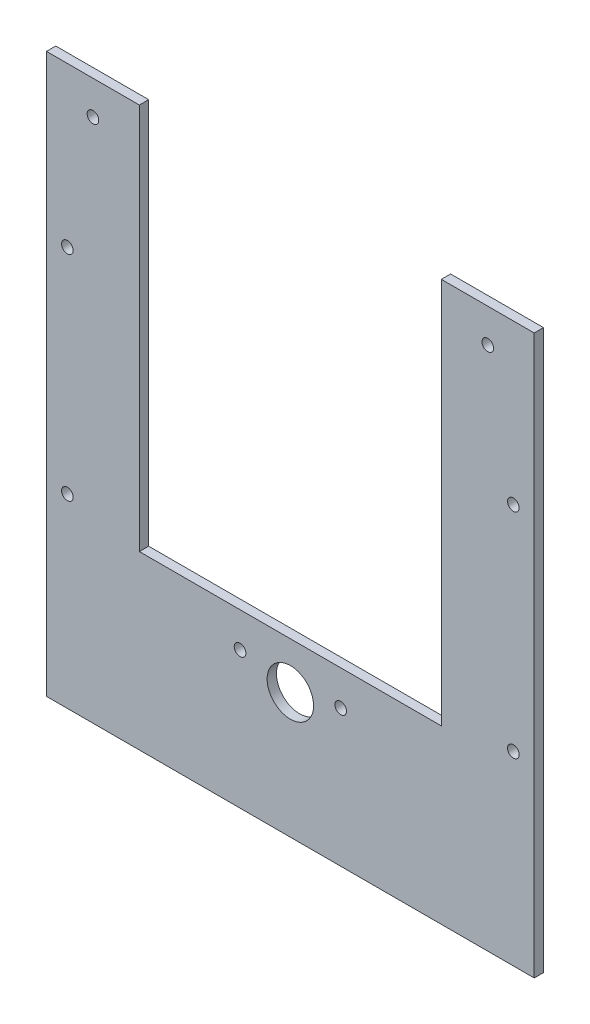
ISO-10303-21;
HEADER;
FILE_DESCRIPTION(('STEP AP214'),'2;1');
FILE_NAME('part.step','',(''),(''),'','','');
FILE_SCHEMA(('AUTOMOTIVE_DESIGN { 1 0 10303 214 1 1 1 1 }'));
ENDSEC;
DATA;
#1=APPLICATION_CONTEXT('core data for automotive mechanical design processes');
#2=APPLICATION_PROTOCOL_DEFINITION('international standard','automotive_design',2000,#1);
#3=PRODUCT_CONTEXT('',#1,'mechanical');
#4=PRODUCT('Part','Part','',(#3));
#5=PRODUCT_RELATED_PRODUCT_CATEGORY('part','',(#4));
#6=PRODUCT_DEFINITION_FORMATION('','',#4);
#7=PRODUCT_DEFINITION_CONTEXT('part definition',#1,'design');
#8=PRODUCT_DEFINITION('design','',#6,#7);
#9=PRODUCT_DEFINITION_SHAPE('','',#8);
#10=(LENGTH_UNIT() NAMED_UNIT(*) SI_UNIT(.MILLI.,.METRE.));
#11=(NAMED_UNIT(*) PLANE_ANGLE_UNIT() SI_UNIT($,.RADIAN.));
#12=(NAMED_UNIT(*) SI_UNIT($,.STERADIAN.) SOLID_ANGLE_UNIT());
#13=UNCERTAINTY_MEASURE_WITH_UNIT(LENGTH_MEASURE(1.E-05),#10,'distance_accuracy_value','');
#14=(GEOMETRIC_REPRESENTATION_CONTEXT(3) GLOBAL_UNCERTAINTY_ASSIGNED_CONTEXT((#13)) GLOBAL_UNIT_ASSIGNED_CONTEXT((#10,
#11,#12)) REPRESENTATION_CONTEXT('',''));
#15=CARTESIAN_POINT('',(0.,0.,0.));
#16=DIRECTION('',(0.,0.,1.));
#17=DIRECTION('',(1.,0.,0.));
#18=AXIS2_PLACEMENT_3D('',#15,#16,#17);
#19=CARTESIAN_POINT('',(0.,0.,4.));
#20=DIRECTION('',(0.,0.,1.));
#21=DIRECTION('',(1.,0.,0.));
#22=AXIS2_PLACEMENT_3D('',#19,#20,#21);
#23=PLANE('',#22);
#24=CARTESIAN_POINT('',(7.16828157057534,762.628389677579,4.));
#25=DIRECTION('',(0.,0.,1.));
#26=DIRECTION('',(1.,0.,0.));
#27=AXIS2_PLACEMENT_3D('',#24,#25,#26);
#28=CIRCLE('',#27,2.5);
#29=CARTESIAN_POINT('',(9.66828157057534,762.628389677579,4.));
#30=VERTEX_POINT('',#29);
#31=EDGE_CURVE('E218',#30,#30,#28,.T.);
#32=ORIENTED_EDGE('',*,*,#31,.F.);
#33=EDGE_LOOP('',(#32));
#34=FACE_BOUND('',#33,.T.);
#35=CARTESIAN_POINT('',(-110.498385096091,875.618389677579,4.));
#36=DIRECTION('',(0.,0.,1.));
#37=DIRECTION('',(1.,0.,0.));
#38=AXIS2_PLACEMENT_3D('',#35,#36,#37);
#39=CIRCLE('',#38,2.5);
#40=CARTESIAN_POINT('',(-107.998385096091,875.618389677579,4.));
#41=VERTEX_POINT('',#40);
#42=EDGE_CURVE('E206',#41,#41,#39,.T.);
#43=ORIENTED_EDGE('',*,*,#42,.F.);
#44=EDGE_LOOP('',(#43));
#45=FACE_BOUND('',#44,.T.);
#46=CARTESIAN_POINT('',(-36.165051762758,762.628389677579,4.));
#47=DIRECTION('',(0.,0.,1.));
#48=DIRECTION('',(1.,0.,0.));
#49=AXIS2_PLACEMENT_3D('',#46,#47,#48);
#50=CIRCLE('',#49,2.5);
#51=CARTESIAN_POINT('',(-33.665051762758,762.628389677579,4.));
#52=VERTEX_POINT('',#51);
#53=EDGE_CURVE('E194',#52,#52,#50,.T.);
#54=ORIENTED_EDGE('',*,*,#53,.F.);
#55=EDGE_LOOP('',(#54));
#56=FACE_BOUND('',#55,.T.);
#57=CARTESIAN_POINT('',(81.5016149039087,875.618389677579,4.));
#58=DIRECTION('',(0.,0.,1.));
#59=DIRECTION('',(1.,0.,0.));
#60=AXIS2_PLACEMENT_3D('',#57,#58,#59);
#61=CIRCLE('',#60,2.50000000000004);
#62=CARTESIAN_POINT('',(84.0016149039087,875.618389677579,4.));
#63=VERTEX_POINT('',#62);
#64=EDGE_CURVE('E182',#63,#63,#61,.T.);
#65=ORIENTED_EDGE('',*,*,#64,.F.);
#66=EDGE_LOOP('',(#65));
#67=FACE_BOUND('',#66,.T.);
#68=DIRECTION('',(0.,1.,0.));
#69=VECTOR('',#68,1.);
#70=CARTESIAN_POINT('',(90.5016149039087,703.628389677579,4.));
#71=LINE('',#70,#69);
#72=CARTESIAN_POINT('',(90.5016149039087,703.628389677579,4.));
#73=VERTEX_POINT('',#72);
#74=CARTESIAN_POINT('',(90.5016149039087,944.128389677579,4.));
#75=VERTEX_POINT('',#74);
#76=EDGE_CURVE('E145',#73,#75,#71,.T.);
#77=ORIENTED_EDGE('',*,*,#76,.T.);
#78=DIRECTION('',(-1.,0.,0.));
#79=VECTOR('',#78,1.);
#80=CARTESIAN_POINT('',(90.5016149039087,944.128389677579,4.));
#81=LINE('',#80,#79);
#82=CARTESIAN_POINT('',(50.5016149039087,944.128389677579,4.));
#83=VERTEX_POINT('',#82);
#84=EDGE_CURVE('E93',#75,#83,#81,.T.);
#85=ORIENTED_EDGE('',*,*,#84,.T.);
#86=DIRECTION('',(0.,-1.,0.));
#87=VECTOR('',#86,1.);
#88=CARTESIAN_POINT('',(50.5016149039087,777.628389677579,4.));
#89=LINE('',#88,#87);
#90=CARTESIAN_POINT('',(50.5016149039087,777.628389677579,4.));
#91=VERTEX_POINT('',#90);
#92=EDGE_CURVE('E160',#83,#91,#89,.T.);
#93=ORIENTED_EDGE('',*,*,#92,.T.);
#94=DIRECTION('',(-1.,0.,0.));
#95=VECTOR('',#94,1.);
#96=CARTESIAN_POINT('',(-79.4983850960913,777.628389677579,4.));
#97=LINE('',#96,#95);
#98=CARTESIAN_POINT('',(-79.4983850960913,777.628389677579,4.));
#99=VERTEX_POINT('',#98);
#100=EDGE_CURVE('E173',#91,#99,#97,.T.);
#101=ORIENTED_EDGE('',*,*,#100,.T.);
#102=DIRECTION('',(0.,1.,0.));
#103=VECTOR('',#102,1.);
#104=CARTESIAN_POINT('',(-79.4983850960913,944.128389677579,4.));
#105=LINE('',#104,#103);
#106=CARTESIAN_POINT('',(-79.4983850960913,944.128389677579,4.));
#107=VERTEX_POINT('',#106);
#108=EDGE_CURVE('E112',#99,#107,#105,.T.);
#109=ORIENTED_EDGE('',*,*,#108,.T.);
#110=DIRECTION('',(-1.,0.,0.));
#111=VECTOR('',#110,1.);
#112=CARTESIAN_POINT('',(-79.4983850960913,944.128389677579,4.));
#113=LINE('',#112,#111);
#114=CARTESIAN_POINT('',(-119.498385096091,944.128389677579,4.));
#115=VERTEX_POINT('',#114);
#116=EDGE_CURVE('E106',#107,#115,#113,.T.);
#117=ORIENTED_EDGE('',*,*,#116,.T.);
#118=DIRECTION('',(0.,-1.,0.));
#119=VECTOR('',#118,1.);
#120=CARTESIAN_POINT('',(-119.498385096091,703.628389677579,4.));
#121=LINE('',#120,#119);
#122=CARTESIAN_POINT('',(-119.498385096091,703.628389677579,4.));
#123=VERTEX_POINT('',#122);
#124=EDGE_CURVE('E110',#115,#123,#121,.T.);
#125=ORIENTED_EDGE('',*,*,#124,.T.);
#126=DIRECTION('',(1.,0.,0.));
#127=VECTOR('',#126,1.);
#128=CARTESIAN_POINT('',(90.5016149039087,703.628389677579,4.));
#129=LINE('',#128,#127);
#130=EDGE_CURVE('E50',#123,#73,#129,.T.);
#131=ORIENTED_EDGE('',*,*,#130,.T.);
#132=EDGE_LOOP('',(#77,#85,#93,#101,#109,#117,#125,#131));
#133=FACE_BOUND('',#132,.T.);
#134=CARTESIAN_POINT('',(70.5016149039087,929.628389677579,4.));
#135=DIRECTION('',(0.,0.,1.));
#136=DIRECTION('',(1.,0.,0.));
#137=AXIS2_PLACEMENT_3D('',#134,#135,#136);
#138=CIRCLE('',#137,2.50000000000002);
#139=CARTESIAN_POINT('',(73.0016149039087,929.628389677579,4.));
#140=VERTEX_POINT('',#139);
#141=EDGE_CURVE('E134',#140,#140,#138,.T.);
#142=ORIENTED_EDGE('',*,*,#141,.F.);
#143=EDGE_LOOP('',(#142));
#144=FACE_BOUND('',#143,.T.);
#145=CARTESIAN_POINT('',(81.5016149039087,783.618389677579,4.));
#146=DIRECTION('',(0.,0.,1.));
#147=DIRECTION('',(1.,0.,0.));
#148=AXIS2_PLACEMENT_3D('',#145,#146,#147);
#149=CIRCLE('',#148,2.49999999999997);
#150=CARTESIAN_POINT('',(84.0016149039087,783.618389677579,4.));
#151=VERTEX_POINT('',#150);
#152=EDGE_CURVE('E188',#151,#151,#149,.T.);
#153=ORIENTED_EDGE('',*,*,#152,.F.);
#154=EDGE_LOOP('',(#153));
#155=FACE_BOUND('',#154,.T.);
#156=CARTESIAN_POINT('',(-110.498385096091,783.618389677579,4.));
#157=DIRECTION('',(0.,0.,1.));
#158=DIRECTION('',(1.,0.,0.));
#159=AXIS2_PLACEMENT_3D('',#156,#157,#158);
#160=CIRCLE('',#159,2.5);
#161=CARTESIAN_POINT('',(-107.998385096091,783.618389677579,4.));
#162=VERTEX_POINT('',#161);
#163=EDGE_CURVE('E200',#162,#162,#160,.T.);
#164=ORIENTED_EDGE('',*,*,#163,.F.);
#165=EDGE_LOOP('',(#164));
#166=FACE_BOUND('',#165,.T.);
#167=CARTESIAN_POINT('',(-99.4983850960913,929.628389677579,4.));
#168=DIRECTION('',(0.,0.,1.));
#169=DIRECTION('',(1.,0.,0.));
#170=AXIS2_PLACEMENT_3D('',#167,#168,#169);
#171=CIRCLE('',#170,2.50000000000001);
#172=CARTESIAN_POINT('',(-96.9983850960913,929.628389677579,4.));
#173=VERTEX_POINT('',#172);
#174=EDGE_CURVE('E212',#173,#173,#171,.T.);
#175=ORIENTED_EDGE('',*,*,#174,.F.);
#176=EDGE_LOOP('',(#175));
#177=FACE_BOUND('',#176,.T.);
#178=CARTESIAN_POINT('',(-14.4983850960913,757.628389677579,4.));
#179=DIRECTION('',(0.,0.,1.));
#180=DIRECTION('',(1.,0.,0.));
#181=AXIS2_PLACEMENT_3D('',#178,#179,#180);
#182=CIRCLE('',#181,10.);
#183=CARTESIAN_POINT('',(-4.49838509609131,757.628389677579,4.));
#184=VERTEX_POINT('',#183);
#185=EDGE_CURVE('E224',#184,#184,#182,.T.);
#186=ORIENTED_EDGE('',*,*,#185,.F.);
#187=EDGE_LOOP('',(#186));
#188=FACE_BOUND('',#187,.T.);
#189=ADVANCED_FACE('F33',(#34,#45,#56,#67,#133,#144,#155,#166,#177,#188),#23,.T.);
#190=CARTESIAN_POINT('',(0.,0.,0.));
#191=DIRECTION('',(0.,0.,1.));
#192=DIRECTION('',(1.,0.,0.));
#193=AXIS2_PLACEMENT_3D('',#190,#191,#192);
#194=PLANE('',#193);
#195=DIRECTION('',(0.,1.,0.));
#196=VECTOR('',#195,1.);
#197=CARTESIAN_POINT('',(90.5016149039087,703.628389677579,0.));
#198=LINE('',#197,#196);
#199=CARTESIAN_POINT('',(90.5016149039087,703.628389677579,0.));
#200=VERTEX_POINT('',#199);
#201=CARTESIAN_POINT('',(90.5016149039087,944.128389677579,0.));
#202=VERTEX_POINT('',#201);
#203=EDGE_CURVE('E130',#200,#202,#198,.T.);
#204=ORIENTED_EDGE('',*,*,#203,.F.);
#205=DIRECTION('',(1.,0.,0.));
#206=VECTOR('',#205,1.);
#207=CARTESIAN_POINT('',(90.5016149039087,703.628389677579,0.));
#208=LINE('',#207,#206);
#209=CARTESIAN_POINT('',(-119.498385096091,703.628389677579,0.));
#210=VERTEX_POINT('',#209);
#211=EDGE_CURVE('E85',#210,#200,#208,.T.);
#212=ORIENTED_EDGE('',*,*,#211,.F.);
#213=DIRECTION('',(0.,-1.,0.));
#214=VECTOR('',#213,1.);
#215=CARTESIAN_POINT('',(-119.498385096091,703.628389677579,0.));
#216=LINE('',#215,#214);
#217=CARTESIAN_POINT('',(-119.498385096091,944.128389677579,0.));
#218=VERTEX_POINT('',#217);
#219=EDGE_CURVE('E79',#218,#210,#216,.T.);
#220=ORIENTED_EDGE('',*,*,#219,.F.);
#221=DIRECTION('',(-1.,0.,0.));
#222=VECTOR('',#221,1.);
#223=CARTESIAN_POINT('',(-79.4983850960913,944.128389677579,0.));
#224=LINE('',#223,#222);
#225=CARTESIAN_POINT('',(-79.4983850960913,944.128389677579,0.));
#226=VERTEX_POINT('',#225);
#227=EDGE_CURVE('E120',#226,#218,#224,.T.);
#228=ORIENTED_EDGE('',*,*,#227,.F.);
#229=DIRECTION('',(0.,1.,0.));
#230=VECTOR('',#229,1.);
#231=CARTESIAN_POINT('',(-79.4983850960913,944.128389677579,0.));
#232=LINE('',#231,#230);
#233=CARTESIAN_POINT('',(-79.4983850960913,777.628389677579,0.));
#234=VERTEX_POINT('',#233);
#235=EDGE_CURVE('E140',#234,#226,#232,.T.);
#236=ORIENTED_EDGE('',*,*,#235,.F.);
#237=DIRECTION('',(-1.,0.,0.));
#238=VECTOR('',#237,1.);
#239=CARTESIAN_POINT('',(-79.4983850960913,777.628389677579,0.));
#240=LINE('',#239,#238);
#241=CARTESIAN_POINT('',(50.5016149039087,777.628389677579,0.));
#242=VERTEX_POINT('',#241);
#243=EDGE_CURVE('E138',#242,#234,#240,.T.);
#244=ORIENTED_EDGE('',*,*,#243,.F.);
#245=DIRECTION('',(0.,-1.,0.));
#246=VECTOR('',#245,1.);
#247=CARTESIAN_POINT('',(50.5016149039087,777.628389677579,0.));
#248=LINE('',#247,#246);
#249=CARTESIAN_POINT('',(50.5016149039087,944.128389677579,0.));
#250=VERTEX_POINT('',#249);
#251=EDGE_CURVE('E136',#250,#242,#248,.T.);
#252=ORIENTED_EDGE('',*,*,#251,.F.);
#253=DIRECTION('',(-1.,0.,0.));
#254=VECTOR('',#253,1.);
#255=CARTESIAN_POINT('',(90.5016149039087,944.128389677579,0.));
#256=LINE('',#255,#254);
#257=EDGE_CURVE('E133',#202,#250,#256,.T.);
#258=ORIENTED_EDGE('',*,*,#257,.F.);
#259=EDGE_LOOP('',(#204,#212,#220,#228,#236,#244,#252,#258));
#260=FACE_BOUND('',#259,.T.);
#261=CARTESIAN_POINT('',(70.5016149039087,929.628389677579,0.));
#262=DIRECTION('',(0.,0.,1.));
#263=DIRECTION('',(1.,0.,0.));
#264=AXIS2_PLACEMENT_3D('',#261,#262,#263);
#265=CIRCLE('',#264,2.50000000000002);
#266=CARTESIAN_POINT('',(73.0016149039087,929.628389677579,0.));
#267=VERTEX_POINT('',#266);
#268=EDGE_CURVE('E179',#267,#267,#265,.T.);
#269=ORIENTED_EDGE('',*,*,#268,.T.);
#270=EDGE_LOOP('',(#269));
#271=FACE_BOUND('',#270,.T.);
#272=CARTESIAN_POINT('',(81.5016149039087,875.618389677579,0.));
#273=DIRECTION('',(0.,0.,1.));
#274=DIRECTION('',(1.,0.,0.));
#275=AXIS2_PLACEMENT_3D('',#272,#273,#274);
#276=CIRCLE('',#275,2.50000000000004);
#277=CARTESIAN_POINT('',(84.0016149039087,875.618389677579,0.));
#278=VERTEX_POINT('',#277);
#279=EDGE_CURVE('E185',#278,#278,#276,.T.);
#280=ORIENTED_EDGE('',*,*,#279,.T.);
#281=EDGE_LOOP('',(#280));
#282=FACE_BOUND('',#281,.T.);
#283=CARTESIAN_POINT('',(81.5016149039087,783.618389677579,0.));
#284=DIRECTION('',(0.,0.,1.));
#285=DIRECTION('',(1.,0.,0.));
#286=AXIS2_PLACEMENT_3D('',#283,#284,#285);
#287=CIRCLE('',#286,2.49999999999997);
#288=CARTESIAN_POINT('',(84.0016149039087,783.618389677579,0.));
#289=VERTEX_POINT('',#288);
#290=EDGE_CURVE('E191',#289,#289,#287,.T.);
#291=ORIENTED_EDGE('',*,*,#290,.T.);
#292=EDGE_LOOP('',(#291));
#293=FACE_BOUND('',#292,.T.);
#294=CARTESIAN_POINT('',(-36.165051762758,762.628389677579,0.));
#295=DIRECTION('',(0.,0.,1.));
#296=DIRECTION('',(1.,0.,0.));
#297=AXIS2_PLACEMENT_3D('',#294,#295,#296);
#298=CIRCLE('',#297,2.5);
#299=CARTESIAN_POINT('',(-33.665051762758,762.628389677579,0.));
#300=VERTEX_POINT('',#299);
#301=EDGE_CURVE('E197',#300,#300,#298,.T.);
#302=ORIENTED_EDGE('',*,*,#301,.T.);
#303=EDGE_LOOP('',(#302));
#304=FACE_BOUND('',#303,.T.);
#305=CARTESIAN_POINT('',(-110.498385096091,783.618389677579,0.));
#306=DIRECTION('',(0.,0.,1.));
#307=DIRECTION('',(1.,0.,0.));
#308=AXIS2_PLACEMENT_3D('',#305,#306,#307);
#309=CIRCLE('',#308,2.5);
#310=CARTESIAN_POINT('',(-107.998385096091,783.618389677579,0.));
#311=VERTEX_POINT('',#310);
#312=EDGE_CURVE('E203',#311,#311,#309,.T.);
#313=ORIENTED_EDGE('',*,*,#312,.T.);
#314=EDGE_LOOP('',(#313));
#315=FACE_BOUND('',#314,.T.);
#316=CARTESIAN_POINT('',(-110.498385096091,875.618389677579,0.));
#317=DIRECTION('',(0.,0.,1.));
#318=DIRECTION('',(1.,0.,0.));
#319=AXIS2_PLACEMENT_3D('',#316,#317,#318);
#320=CIRCLE('',#319,2.5);
#321=CARTESIAN_POINT('',(-107.998385096091,875.618389677579,0.));
#322=VERTEX_POINT('',#321);
#323=EDGE_CURVE('E209',#322,#322,#320,.T.);
#324=ORIENTED_EDGE('',*,*,#323,.T.);
#325=EDGE_LOOP('',(#324));
#326=FACE_BOUND('',#325,.T.);
#327=CARTESIAN_POINT('',(-99.4983850960913,929.628389677579,0.));
#328=DIRECTION('',(0.,0.,1.));
#329=DIRECTION('',(1.,0.,0.));
#330=AXIS2_PLACEMENT_3D('',#327,#328,#329);
#331=CIRCLE('',#330,2.50000000000001);
#332=CARTESIAN_POINT('',(-96.9983850960913,929.628389677579,0.));
#333=VERTEX_POINT('',#332);
#334=EDGE_CURVE('E215',#333,#333,#331,.T.);
#335=ORIENTED_EDGE('',*,*,#334,.T.);
#336=EDGE_LOOP('',(#335));
#337=FACE_BOUND('',#336,.T.);
#338=CARTESIAN_POINT('',(7.16828157057534,762.628389677579,0.));
#339=DIRECTION('',(0.,0.,1.));
#340=DIRECTION('',(1.,0.,0.));
#341=AXIS2_PLACEMENT_3D('',#338,#339,#340);
#342=CIRCLE('',#341,2.5);
#343=CARTESIAN_POINT('',(9.66828157057534,762.628389677579,0.));
#344=VERTEX_POINT('',#343);
#345=EDGE_CURVE('E221',#344,#344,#342,.T.);
#346=ORIENTED_EDGE('',*,*,#345,.T.);
#347=EDGE_LOOP('',(#346));
#348=FACE_BOUND('',#347,.T.);
#349=CARTESIAN_POINT('',(-14.4983850960913,757.628389677579,0.));
#350=DIRECTION('',(0.,0.,1.));
#351=DIRECTION('',(1.,0.,0.));
#352=AXIS2_PLACEMENT_3D('',#349,#350,#351);
#353=CIRCLE('',#352,10.);
#354=CARTESIAN_POINT('',(-4.49838509609131,757.628389677579,0.));
#355=VERTEX_POINT('',#354);
#356=EDGE_CURVE('E227',#355,#355,#353,.T.);
#357=ORIENTED_EDGE('',*,*,#356,.T.);
#358=EDGE_LOOP('',(#357));
#359=FACE_BOUND('',#358,.T.);
#360=ADVANCED_FACE('F164',(#260,#271,#282,#293,#304,#315,#326,#337,#348,#359),#194,.F.);
#361=CARTESIAN_POINT('',(90.5016149039087,703.628389677579,4.));
#362=DIRECTION('',(-1.,0.,0.));
#363=DIRECTION('',(0.,0.,1.));
#364=AXIS2_PLACEMENT_3D('',#361,#362,#363);
#365=PLANE('',#364);
#366=ORIENTED_EDGE('',*,*,#203,.T.);
#367=DIRECTION('',(0.,0.,-1.));
#368=VECTOR('',#367,1.);
#369=CARTESIAN_POINT('',(90.5016149039087,944.128389677579,4.));
#370=LINE('',#369,#368);
#371=EDGE_CURVE('E11',#75,#202,#370,.T.);
#372=ORIENTED_EDGE('',*,*,#371,.F.);
#373=ORIENTED_EDGE('',*,*,#76,.F.);
#374=DIRECTION('',(0.,0.,-1.));
#375=VECTOR('',#374,1.);
#376=CARTESIAN_POINT('',(90.5016149039087,703.628389677579,4.));
#377=LINE('',#376,#375);
#378=EDGE_CURVE('E126',#73,#200,#377,.T.);
#379=ORIENTED_EDGE('',*,*,#378,.T.);
#380=EDGE_LOOP('',(#366,#372,#373,#379));
#381=FACE_BOUND('',#380,.T.);
#382=ADVANCED_FACE('F35',(#381),#365,.F.);
#383=CARTESIAN_POINT('',(90.5016149039087,944.128389677579,4.));
#384=DIRECTION('',(0.,-1.,0.));
#385=DIRECTION('',(0.,0.,-1.));
#386=AXIS2_PLACEMENT_3D('',#383,#384,#385);
#387=PLANE('',#386);
#388=ORIENTED_EDGE('',*,*,#257,.T.);
#389=DIRECTION('',(0.,0.,-1.));
#390=VECTOR('',#389,1.);
#391=CARTESIAN_POINT('',(50.5016149039087,944.128389677579,4.));
#392=LINE('',#391,#390);
#393=EDGE_CURVE('E42',#83,#250,#392,.T.);
#394=ORIENTED_EDGE('',*,*,#393,.F.);
#395=ORIENTED_EDGE('',*,*,#84,.F.);
#396=ORIENTED_EDGE('',*,*,#371,.T.);
#397=EDGE_LOOP('',(#388,#394,#395,#396));
#398=FACE_BOUND('',#397,.T.);
#399=ADVANCED_FACE('F261',(#398),#387,.F.);
#400=CARTESIAN_POINT('',(50.5016149039087,777.628389677579,4.));
#401=DIRECTION('',(1.,0.,0.));
#402=DIRECTION('',(0.,1.,0.));
#403=AXIS2_PLACEMENT_3D('',#400,#401,#402);
#404=PLANE('',#403);
#405=ORIENTED_EDGE('',*,*,#251,.T.);
#406=DIRECTION('',(0.,0.,-1.));
#407=VECTOR('',#406,1.);
#408=CARTESIAN_POINT('',(50.5016149039087,777.628389677579,4.));
#409=LINE('',#408,#407);
#410=EDGE_CURVE('E152',#91,#242,#409,.T.);
#411=ORIENTED_EDGE('',*,*,#410,.F.);
#412=ORIENTED_EDGE('',*,*,#92,.F.);
#413=ORIENTED_EDGE('',*,*,#393,.T.);
#414=EDGE_LOOP('',(#405,#411,#412,#413));
#415=FACE_BOUND('',#414,.T.);
#416=ADVANCED_FACE('F158',(#415),#404,.F.);
#417=CARTESIAN_POINT('',(-79.4983850960913,777.628389677579,4.));
#418=DIRECTION('',(0.,-1.,0.));
#419=DIRECTION('',(0.,0.,-1.));
#420=AXIS2_PLACEMENT_3D('',#417,#418,#419);
#421=PLANE('',#420);
#422=ORIENTED_EDGE('',*,*,#243,.T.);
#423=DIRECTION('',(0.,0.,-1.));
#424=VECTOR('',#423,1.);
#425=CARTESIAN_POINT('',(-79.4983850960913,777.628389677579,4.));
#426=LINE('',#425,#424);
#427=EDGE_CURVE('E149',#99,#234,#426,.T.);
#428=ORIENTED_EDGE('',*,*,#427,.F.);
#429=ORIENTED_EDGE('',*,*,#100,.F.);
#430=ORIENTED_EDGE('',*,*,#410,.T.);
#431=EDGE_LOOP('',(#422,#428,#429,#430));
#432=FACE_BOUND('',#431,.T.);
#433=ADVANCED_FACE('F169',(#432),#421,.F.);
#434=CARTESIAN_POINT('',(-79.4983850960913,944.128389677579,4.));
#435=DIRECTION('',(-1.,0.,0.));
#436=DIRECTION('',(0.,0.,1.));
#437=AXIS2_PLACEMENT_3D('',#434,#435,#436);
#438=PLANE('',#437);
#439=ORIENTED_EDGE('',*,*,#235,.T.);
#440=DIRECTION('',(0.,0.,-1.));
#441=VECTOR('',#440,1.);
#442=CARTESIAN_POINT('',(-79.4983850960913,944.128389677579,4.));
#443=LINE('',#442,#441);
#444=EDGE_CURVE('E121',#107,#226,#443,.T.);
#445=ORIENTED_EDGE('',*,*,#444,.F.);
#446=ORIENTED_EDGE('',*,*,#108,.F.);
#447=ORIENTED_EDGE('',*,*,#427,.T.);
#448=EDGE_LOOP('',(#439,#445,#446,#447));
#449=FACE_BOUND('',#448,.T.);
#450=ADVANCED_FACE('F172',(#449),#438,.F.);
#451=CARTESIAN_POINT('',(-79.4983850960913,944.128389677579,4.));
#452=DIRECTION('',(0.,-1.,0.));
#453=DIRECTION('',(0.,0.,-1.));
#454=AXIS2_PLACEMENT_3D('',#451,#452,#453);
#455=PLANE('',#454);
#456=ORIENTED_EDGE('',*,*,#227,.T.);
#457=DIRECTION('',(0.,0.,-1.));
#458=VECTOR('',#457,1.);
#459=CARTESIAN_POINT('',(-119.498385096091,944.128389677579,4.));
#460=LINE('',#459,#458);
#461=EDGE_CURVE('E117',#115,#218,#460,.T.);
#462=ORIENTED_EDGE('',*,*,#461,.F.);
#463=ORIENTED_EDGE('',*,*,#116,.F.);
#464=ORIENTED_EDGE('',*,*,#444,.T.);
#465=EDGE_LOOP('',(#456,#462,#463,#464));
#466=FACE_BOUND('',#465,.T.);
#467=ADVANCED_FACE('F118',(#466),#455,.F.);
#468=CARTESIAN_POINT('',(-119.498385096091,703.628389677579,4.));
#469=DIRECTION('',(1.,0.,0.));
#470=DIRECTION('',(0.,0.,-1.));
#471=AXIS2_PLACEMENT_3D('',#468,#469,#470);
#472=PLANE('',#471);
#473=ORIENTED_EDGE('',*,*,#219,.T.);
#474=DIRECTION('',(0.,0.,-1.));
#475=VECTOR('',#474,1.);
#476=CARTESIAN_POINT('',(-119.498385096091,703.628389677579,4.));
#477=LINE('',#476,#475);
#478=EDGE_CURVE('E122',#123,#210,#477,.T.);
#479=ORIENTED_EDGE('',*,*,#478,.F.);
#480=ORIENTED_EDGE('',*,*,#124,.F.);
#481=ORIENTED_EDGE('',*,*,#461,.T.);
#482=EDGE_LOOP('',(#473,#479,#480,#481));
#483=FACE_BOUND('',#482,.T.);
#484=ADVANCED_FACE('F124',(#483),#472,.F.);
#485=CARTESIAN_POINT('',(90.5016149039087,703.628389677579,4.));
#486=DIRECTION('',(0.,1.,0.));
#487=DIRECTION('',(0.,0.,1.));
#488=AXIS2_PLACEMENT_3D('',#485,#486,#487);
#489=PLANE('',#488);
#490=ORIENTED_EDGE('',*,*,#211,.T.);
#491=ORIENTED_EDGE('',*,*,#378,.F.);
#492=ORIENTED_EDGE('',*,*,#130,.F.);
#493=ORIENTED_EDGE('',*,*,#478,.T.);
#494=EDGE_LOOP('',(#490,#491,#492,#493));
#495=FACE_BOUND('',#494,.T.);
#496=ADVANCED_FACE('F249',(#495),#489,.F.);
#497=CARTESIAN_POINT('',(70.5016149039087,929.628389677579,4.));
#498=DIRECTION('',(0.,0.,-1.));
#499=DIRECTION('',(-1.,0.,0.));
#500=AXIS2_PLACEMENT_3D('',#497,#498,#499);
#501=CYLINDRICAL_SURFACE('',#500,2.50000000000002);
#502=ORIENTED_EDGE('',*,*,#141,.T.);
#503=EDGE_LOOP('',(#502));
#504=FACE_BOUND('',#503,.T.);
#505=ORIENTED_EDGE('',*,*,#268,.F.);
#506=EDGE_LOOP('',(#505));
#507=FACE_BOUND('',#506,.T.);
#508=ADVANCED_FACE('F246',(#504,#507),#501,.F.);
#509=CARTESIAN_POINT('',(81.5016149039087,875.618389677579,4.));
#510=DIRECTION('',(0.,0.,-1.));
#511=DIRECTION('',(-1.,0.,0.));
#512=AXIS2_PLACEMENT_3D('',#509,#510,#511);
#513=CYLINDRICAL_SURFACE('',#512,2.50000000000004);
#514=ORIENTED_EDGE('',*,*,#64,.T.);
#515=EDGE_LOOP('',(#514));
#516=FACE_BOUND('',#515,.T.);
#517=ORIENTED_EDGE('',*,*,#279,.F.);
#518=EDGE_LOOP('',(#517));
#519=FACE_BOUND('',#518,.T.);
#520=ADVANCED_FACE('F325',(#516,#519),#513,.F.);
#521=CARTESIAN_POINT('',(81.5016149039087,783.618389677579,4.));
#522=DIRECTION('',(0.,0.,-1.));
#523=DIRECTION('',(-1.,0.,0.));
#524=AXIS2_PLACEMENT_3D('',#521,#522,#523);
#525=CYLINDRICAL_SURFACE('',#524,2.49999999999997);
#526=ORIENTED_EDGE('',*,*,#152,.T.);
#527=EDGE_LOOP('',(#526));
#528=FACE_BOUND('',#527,.T.);
#529=ORIENTED_EDGE('',*,*,#290,.F.);
#530=EDGE_LOOP('',(#529));
#531=FACE_BOUND('',#530,.T.);
#532=ADVANCED_FACE('F333',(#528,#531),#525,.F.);
#533=CARTESIAN_POINT('',(-36.165051762758,762.628389677579,4.));
#534=DIRECTION('',(0.,0.,-1.));
#535=DIRECTION('',(-1.,0.,0.));
#536=AXIS2_PLACEMENT_3D('',#533,#534,#535);
#537=CYLINDRICAL_SURFACE('',#536,2.5);
#538=ORIENTED_EDGE('',*,*,#53,.T.);
#539=EDGE_LOOP('',(#538));
#540=FACE_BOUND('',#539,.T.);
#541=ORIENTED_EDGE('',*,*,#301,.F.);
#542=EDGE_LOOP('',(#541));
#543=FACE_BOUND('',#542,.T.);
#544=ADVANCED_FACE('F341',(#540,#543),#537,.F.);
#545=CARTESIAN_POINT('',(-110.498385096091,783.618389677579,4.));
#546=DIRECTION('',(0.,0.,-1.));
#547=DIRECTION('',(-1.,0.,0.));
#548=AXIS2_PLACEMENT_3D('',#545,#546,#547);
#549=CYLINDRICAL_SURFACE('',#548,2.5);
#550=ORIENTED_EDGE('',*,*,#163,.T.);
#551=EDGE_LOOP('',(#550));
#552=FACE_BOUND('',#551,.T.);
#553=ORIENTED_EDGE('',*,*,#312,.F.);
#554=EDGE_LOOP('',(#553));
#555=FACE_BOUND('',#554,.T.);
#556=ADVANCED_FACE('F350',(#552,#555),#549,.F.);
#557=CARTESIAN_POINT('',(-110.498385096091,875.618389677579,4.));
#558=DIRECTION('',(0.,0.,-1.));
#559=DIRECTION('',(-1.,0.,0.));
#560=AXIS2_PLACEMENT_3D('',#557,#558,#559);
#561=CYLINDRICAL_SURFACE('',#560,2.5);
#562=ORIENTED_EDGE('',*,*,#42,.T.);
#563=EDGE_LOOP('',(#562));
#564=FACE_BOUND('',#563,.T.);
#565=ORIENTED_EDGE('',*,*,#323,.F.);
#566=EDGE_LOOP('',(#565));
#567=FACE_BOUND('',#566,.T.);
#568=ADVANCED_FACE('F359',(#564,#567),#561,.F.);
#569=CARTESIAN_POINT('',(-99.4983850960913,929.628389677579,4.));
#570=DIRECTION('',(0.,0.,-1.));
#571=DIRECTION('',(-1.,0.,0.));
#572=AXIS2_PLACEMENT_3D('',#569,#570,#571);
#573=CYLINDRICAL_SURFACE('',#572,2.50000000000001);
#574=ORIENTED_EDGE('',*,*,#174,.T.);
#575=EDGE_LOOP('',(#574));
#576=FACE_BOUND('',#575,.T.);
#577=ORIENTED_EDGE('',*,*,#334,.F.);
#578=EDGE_LOOP('',(#577));
#579=FACE_BOUND('',#578,.T.);
#580=ADVANCED_FACE('F368',(#576,#579),#573,.F.);
#581=CARTESIAN_POINT('',(7.16828157057534,762.628389677579,4.));
#582=DIRECTION('',(0.,0.,-1.));
#583=DIRECTION('',(-1.,0.,0.));
#584=AXIS2_PLACEMENT_3D('',#581,#582,#583);
#585=CYLINDRICAL_SURFACE('',#584,2.5);
#586=ORIENTED_EDGE('',*,*,#31,.T.);
#587=EDGE_LOOP('',(#586));
#588=FACE_BOUND('',#587,.T.);
#589=ORIENTED_EDGE('',*,*,#345,.F.);
#590=EDGE_LOOP('',(#589));
#591=FACE_BOUND('',#590,.T.);
#592=ADVANCED_FACE('F377',(#588,#591),#585,.F.);
#593=CARTESIAN_POINT('',(-14.4983850960913,757.628389677579,4.));
#594=DIRECTION('',(0.,0.,-1.));
#595=DIRECTION('',(-1.,0.,0.));
#596=AXIS2_PLACEMENT_3D('',#593,#594,#595);
#597=CYLINDRICAL_SURFACE('',#596,10.);
#598=ORIENTED_EDGE('',*,*,#185,.T.);
#599=EDGE_LOOP('',(#598));
#600=FACE_BOUND('',#599,.T.);
#601=ORIENTED_EDGE('',*,*,#356,.F.);
#602=EDGE_LOOP('',(#601));
#603=FACE_BOUND('',#602,.T.);
#604=ADVANCED_FACE('F233',(#600,#603),#597,.F.);
#605=CLOSED_SHELL('',(#189,#360,#382,#399,#416,#433,#450,#467,#484,#496,#508,#520,#532,#544,
#556,#568,#580,#592,#604));
#606=MANIFOLD_SOLID_BREP('B2',#605);
#607=ADVANCED_BREP_SHAPE_REPRESENTATION('',(#18,#606),#14);
#608=SHAPE_DEFINITION_REPRESENTATION(#9,#607);
ENDSEC;
END-ISO-10303-21;
